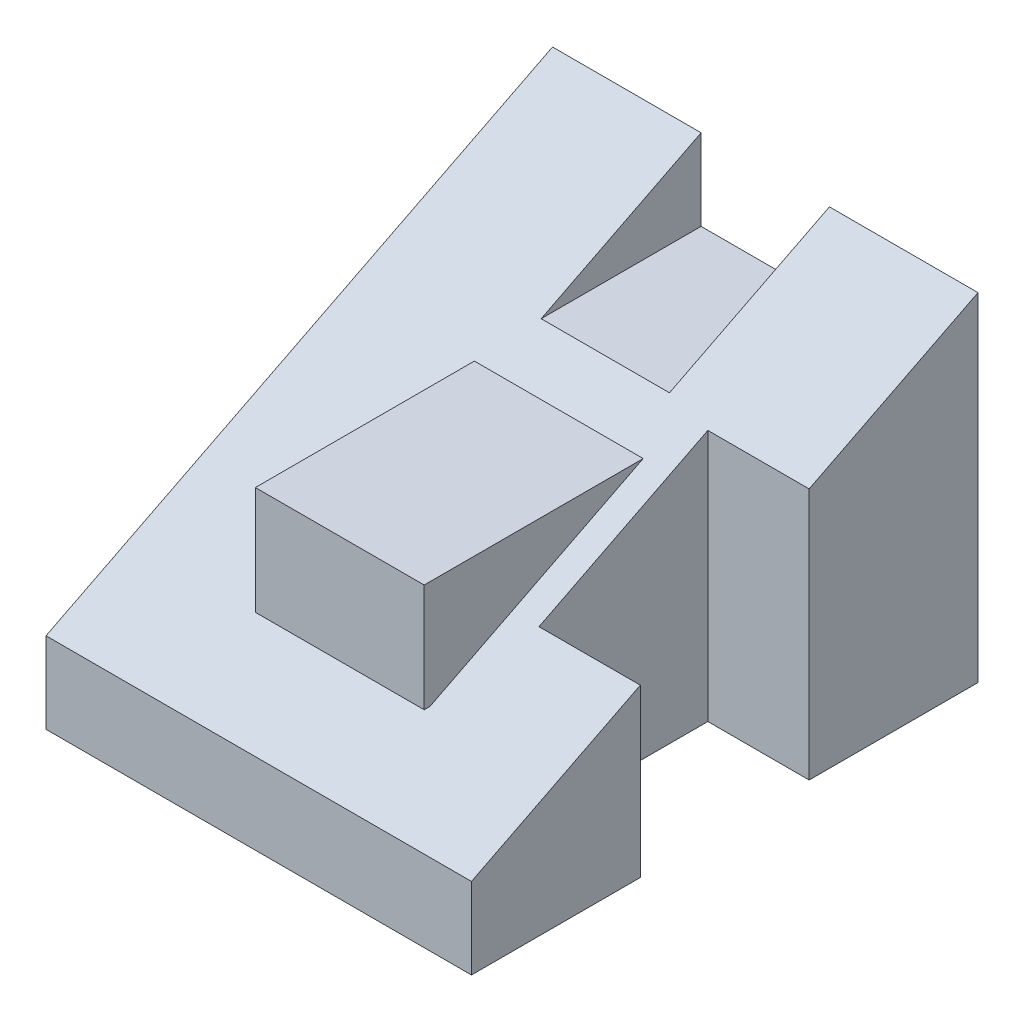
ISO-10303-21;
HEADER;
FILE_DESCRIPTION(('STEP AP214'),'2;1');
FILE_NAME('part.step','',(''),(''),'','','');
FILE_SCHEMA(('AUTOMOTIVE_DESIGN { 1 0 10303 214 1 1 1 1 }'));
ENDSEC;
DATA;
#1=APPLICATION_CONTEXT('core data for automotive mechanical design processes');
#2=APPLICATION_PROTOCOL_DEFINITION('international standard','automotive_design',2000,#1);
#3=PRODUCT_CONTEXT('',#1,'mechanical');
#4=PRODUCT('Part','Part','',(#3));
#5=PRODUCT_RELATED_PRODUCT_CATEGORY('part','',(#4));
#6=PRODUCT_DEFINITION_FORMATION('','',#4);
#7=PRODUCT_DEFINITION_CONTEXT('part definition',#1,'design');
#8=PRODUCT_DEFINITION('design','',#6,#7);
#9=PRODUCT_DEFINITION_SHAPE('','',#8);
#10=(LENGTH_UNIT() NAMED_UNIT(*) SI_UNIT(.MILLI.,.METRE.));
#11=(NAMED_UNIT(*) PLANE_ANGLE_UNIT() SI_UNIT($,.RADIAN.));
#12=(NAMED_UNIT(*) SI_UNIT($,.STERADIAN.) SOLID_ANGLE_UNIT());
#13=UNCERTAINTY_MEASURE_WITH_UNIT(LENGTH_MEASURE(1.E-05),#10,'distance_accuracy_value','');
#14=(GEOMETRIC_REPRESENTATION_CONTEXT(3) GLOBAL_UNCERTAINTY_ASSIGNED_CONTEXT((#13)) GLOBAL_UNIT_ASSIGNED_CONTEXT((#10,
#11,#12)) REPRESENTATION_CONTEXT('',''));
#15=CARTESIAN_POINT('',(0.,0.,0.));
#16=DIRECTION('',(0.,0.,1.));
#17=DIRECTION('',(1.,0.,0.));
#18=AXIS2_PLACEMENT_3D('',#15,#16,#17);
#19=CARTESIAN_POINT('',(-63.,50.,-75.));
#20=DIRECTION('',(0.,0.892035776030269,0.45196479318867));
#21=DIRECTION('',(0.,-0.45196479318867,0.892035776030269));
#22=AXIS2_PLACEMENT_3D('',#19,#20,#21);
#23=PLANE('',#22);
#24=DIRECTION('',(0.,0.45196479318867,-0.892035776030269));
#25=VECTOR('',#24,1.);
#26=CARTESIAN_POINT('',(-41.,17.310673362569,-10.4815921629651));
#27=LINE('',#26,#25);
#28=CARTESIAN_POINT('',(-41.,38.,-51.3157894736842));
#29=VERTEX_POINT('',#28);
#30=CARTESIAN_POINT('',(-41.,50.,-75.));
#31=VERTEX_POINT('',#30);
#32=EDGE_CURVE('E234',#29,#31,#27,.T.);
#33=ORIENTED_EDGE('',*,*,#32,.T.);
#34=DIRECTION('',(1.,0.,0.));
#35=VECTOR('',#34,1.);
#36=CARTESIAN_POINT('',(-63.,50.,-75.));
#37=LINE('',#36,#35);
#38=CARTESIAN_POINT('',(-63.,50.,-75.));
#39=VERTEX_POINT('',#38);
#40=EDGE_CURVE('E75',#39,#31,#37,.T.);
#41=ORIENTED_EDGE('',*,*,#40,.F.);
#42=DIRECTION('',(0.,-0.451964793188669,0.892035776030268));
#43=VECTOR('',#42,1.);
#44=CARTESIAN_POINT('',(-63.,50.,-75.));
#45=LINE('',#44,#43);
#46=CARTESIAN_POINT('',(-63.,12.,0.));
#47=VERTEX_POINT('',#46);
#48=EDGE_CURVE('E303',#39,#47,#45,.T.);
#49=ORIENTED_EDGE('',*,*,#48,.T.);
#50=DIRECTION('',(1.,0.,0.));
#51=VECTOR('',#50,1.);
#52=CARTESIAN_POINT('',(-63.,12.,0.));
#53=LINE('',#52,#51);
#54=CARTESIAN_POINT('',(0.,12.,0.));
#55=VERTEX_POINT('',#54);
#56=EDGE_CURVE('E12',#47,#55,#53,.T.);
#57=ORIENTED_EDGE('',*,*,#56,.T.);
#58=DIRECTION('',(0.,-0.451964793188669,0.892035776030268));
#59=VECTOR('',#58,1.);
#60=CARTESIAN_POINT('',(0.,50.,-75.));
#61=LINE('',#60,#59);
#62=CARTESIAN_POINT('',(0.,24.6666666666667,-25.));
#63=VERTEX_POINT('',#62);
#64=EDGE_CURVE('E319',#63,#55,#61,.T.);
#65=ORIENTED_EDGE('',*,*,#64,.F.);
#66=DIRECTION('',(1.,0.,0.));
#67=VECTOR('',#66,1.);
#68=CARTESIAN_POINT('',(-15.,24.6666666666667,-25.));
#69=LINE('',#68,#67);
#70=CARTESIAN_POINT('',(-15.,24.6666666666667,-25.));
#71=VERTEX_POINT('',#70);
#72=EDGE_CURVE('E271',#71,#63,#69,.T.);
#73=ORIENTED_EDGE('',*,*,#72,.F.);
#74=DIRECTION('',(0.,-0.451964793188669,0.892035776030268));
#75=VECTOR('',#74,1.);
#76=CARTESIAN_POINT('',(-15.,24.6666666666667,-25.));
#77=LINE('',#76,#75);
#78=CARTESIAN_POINT('',(-15.,37.3333333333333,-50.));
#79=VERTEX_POINT('',#78);
#80=EDGE_CURVE('E255',#79,#71,#77,.T.);
#81=ORIENTED_EDGE('',*,*,#80,.F.);
#82=DIRECTION('',(1.,0.,0.));
#83=VECTOR('',#82,1.);
#84=CARTESIAN_POINT('',(-15.,37.3333333333333,-50.));
#85=LINE('',#84,#83);
#86=CARTESIAN_POINT('',(0.,37.3333333333333,-50.));
#87=VERTEX_POINT('',#86);
#88=EDGE_CURVE('E276',#79,#87,#85,.T.);
#89=ORIENTED_EDGE('',*,*,#88,.T.);
#90=CARTESIAN_POINT('',(0.,50.,-75.));
#91=VERTEX_POINT('',#90);
#92=EDGE_CURVE('E295',#91,#87,#61,.T.);
#93=ORIENTED_EDGE('',*,*,#92,.F.);
#94=CARTESIAN_POINT('',(-22.,50.,-75.));
#95=VERTEX_POINT('',#94);
#96=EDGE_CURVE('E325',#95,#91,#37,.T.);
#97=ORIENTED_EDGE('',*,*,#96,.F.);
#98=DIRECTION('',(0.,-0.45196479318867,0.892035776030269));
#99=VECTOR('',#98,1.);
#100=CARTESIAN_POINT('',(-22.,19.7619394539539,-15.31961734333));
#101=LINE('',#100,#99);
#102=CARTESIAN_POINT('',(-22.,38.,-51.3157894736842));
#103=VERTEX_POINT('',#102);
#104=EDGE_CURVE('E91',#95,#103,#101,.T.);
#105=ORIENTED_EDGE('',*,*,#104,.T.);
#106=DIRECTION('',(-1.,0.,0.));
#107=VECTOR('',#106,1.);
#108=CARTESIAN_POINT('',(-22.,38.,-51.3157894736842));
#109=LINE('',#108,#107);
#110=EDGE_CURVE('E230',#103,#29,#109,.T.);
#111=ORIENTED_EDGE('',*,*,#110,.T.);
#112=EDGE_LOOP('',(#33,#41,#49,#57,#65,#73,#81,#89,#93,#97,#105,#111));
#113=FACE_BOUND('',#112,.T.);
#114=DIRECTION('',(-1.,0.,0.));
#115=VECTOR('',#114,1.);
#116=CARTESIAN_POINT('',(0.,34.5104040234503,-44.4284289936519));
#117=LINE('',#116,#115);
#118=CARTESIAN_POINT('',(-19.,34.5104040234503,-44.4284289936519));
#119=VERTEX_POINT('',#118);
#120=CARTESIAN_POINT('',(-44.,34.5104040234503,-44.4284289936519));
#121=VERTEX_POINT('',#120);
#122=EDGE_CURVE('E184',#119,#121,#117,.T.);
#123=ORIENTED_EDGE('',*,*,#122,.F.);
#124=DIRECTION('',(0.,0.45196479318867,-0.892035776030269));
#125=VECTOR('',#124,1.);
#126=CARTESIAN_POINT('',(-19.,39.7871976234262,-54.8431532041307));
#127=LINE('',#126,#125);
#128=CARTESIAN_POINT('',(-19.,18.5104040234503,-12.8494816252308));
#129=VERTEX_POINT('',#128);
#130=EDGE_CURVE('E181',#129,#119,#127,.T.);
#131=ORIENTED_EDGE('',*,*,#130,.F.);
#132=DIRECTION('',(-1.,0.,0.));
#133=VECTOR('',#132,1.);
#134=CARTESIAN_POINT('',(0.,18.5104040234503,-12.8494816252308));
#135=LINE('',#134,#133);
#136=CARTESIAN_POINT('',(-44.,18.5104040234503,-12.8494816252308));
#137=VERTEX_POINT('',#136);
#138=EDGE_CURVE('E216',#129,#137,#135,.T.);
#139=ORIENTED_EDGE('',*,*,#138,.T.);
#140=DIRECTION('',(0.,0.45196479318867,-0.892035776030269));
#141=VECTOR('',#140,1.);
#142=CARTESIAN_POINT('',(-44.,39.7871976234262,-54.8431532041307));
#143=LINE('',#142,#141);
#144=EDGE_CURVE('E220',#137,#121,#143,.T.);
#145=ORIENTED_EDGE('',*,*,#144,.T.);
#146=EDGE_LOOP('',(#123,#131,#139,#145));
#147=FACE_BOUND('',#146,.T.);
#148=ADVANCED_FACE('F65',(#113,#147),#23,.T.);
#149=CARTESIAN_POINT('',(0.,0.,0.));
#150=DIRECTION('',(1.,0.,0.));
#151=DIRECTION('',(0.,0.,-1.));
#152=AXIS2_PLACEMENT_3D('',#149,#150,#151);
#153=PLANE('',#152);
#154=DIRECTION('',(0.,1.,0.));
#155=VECTOR('',#154,1.);
#156=CARTESIAN_POINT('',(0.,37.3333333333333,-50.));
#157=LINE('',#156,#155);
#158=CARTESIAN_POINT('',(0.,0.,-50.));
#159=VERTEX_POINT('',#158);
#160=EDGE_CURVE('E260',#159,#87,#157,.T.);
#161=ORIENTED_EDGE('',*,*,#160,.F.);
#162=DIRECTION('',(0.,0.,-1.));
#163=VECTOR('',#162,1.);
#164=CARTESIAN_POINT('',(0.,0.,0.));
#165=LINE('',#164,#163);
#166=CARTESIAN_POINT('',(0.,0.,-75.));
#167=VERTEX_POINT('',#166);
#168=EDGE_CURVE('E310',#159,#167,#165,.T.);
#169=ORIENTED_EDGE('',*,*,#168,.T.);
#170=DIRECTION('',(0.,1.,0.));
#171=VECTOR('',#170,1.);
#172=CARTESIAN_POINT('',(0.,0.,-75.));
#173=LINE('',#172,#171);
#174=EDGE_CURVE('E315',#167,#91,#173,.T.);
#175=ORIENTED_EDGE('',*,*,#174,.T.);
#176=ORIENTED_EDGE('',*,*,#92,.T.);
#177=EDGE_LOOP('',(#161,#169,#175,#176));
#178=FACE_BOUND('',#177,.T.);
#179=ADVANCED_FACE('F361',(#178),#153,.T.);
#180=CARTESIAN_POINT('',(-63.,12.,0.));
#181=DIRECTION('',(0.,0.,1.));
#182=DIRECTION('',(1.,0.,0.));
#183=AXIS2_PLACEMENT_3D('',#180,#181,#182);
#184=PLANE('',#183);
#185=DIRECTION('',(0.,-1.,0.));
#186=VECTOR('',#185,1.);
#187=CARTESIAN_POINT('',(0.,12.,0.));
#188=LINE('',#187,#186);
#189=CARTESIAN_POINT('',(0.,0.,0.));
#190=VERTEX_POINT('',#189);
#191=EDGE_CURVE('E280',#55,#190,#188,.T.);
#192=ORIENTED_EDGE('',*,*,#191,.F.);
#193=ORIENTED_EDGE('',*,*,#56,.F.);
#194=DIRECTION('',(0.,-1.,0.));
#195=VECTOR('',#194,1.);
#196=CARTESIAN_POINT('',(-63.,12.,0.));
#197=LINE('',#196,#195);
#198=CARTESIAN_POINT('',(-63.,0.,0.));
#199=VERTEX_POINT('',#198);
#200=EDGE_CURVE('E290',#47,#199,#197,.T.);
#201=ORIENTED_EDGE('',*,*,#200,.T.);
#202=DIRECTION('',(1.,0.,0.));
#203=VECTOR('',#202,1.);
#204=CARTESIAN_POINT('',(-63.,0.,0.));
#205=LINE('',#204,#203);
#206=EDGE_CURVE('E69',#199,#190,#205,.T.);
#207=ORIENTED_EDGE('',*,*,#206,.T.);
#208=EDGE_LOOP('',(#192,#193,#201,#207));
#209=FACE_BOUND('',#208,.T.);
#210=ADVANCED_FACE('F67',(#209),#184,.T.);
#211=CARTESIAN_POINT('',(-63.,0.,-75.));
#212=DIRECTION('',(0.,0.,-1.));
#213=DIRECTION('',(-1.,0.,0.));
#214=AXIS2_PLACEMENT_3D('',#211,#212,#213);
#215=PLANE('',#214);
#216=DIRECTION('',(0.,1.,0.));
#217=VECTOR('',#216,1.);
#218=CARTESIAN_POINT('',(-41.,38.,-75.));
#219=LINE('',#218,#217);
#220=CARTESIAN_POINT('',(-41.,38.,-75.));
#221=VERTEX_POINT('',#220);
#222=EDGE_CURVE('E245',#221,#31,#219,.T.);
#223=ORIENTED_EDGE('',*,*,#222,.F.);
#224=DIRECTION('',(-1.,0.,0.));
#225=VECTOR('',#224,1.);
#226=CARTESIAN_POINT('',(-22.,38.,-75.));
#227=LINE('',#226,#225);
#228=CARTESIAN_POINT('',(-22.,38.,-75.));
#229=VERTEX_POINT('',#228);
#230=EDGE_CURVE('E241',#229,#221,#227,.T.);
#231=ORIENTED_EDGE('',*,*,#230,.F.);
#232=DIRECTION('',(0.,-1.,0.));
#233=VECTOR('',#232,1.);
#234=CARTESIAN_POINT('',(-22.,50.,-75.));
#235=LINE('',#234,#233);
#236=EDGE_CURVE('E238',#95,#229,#235,.T.);
#237=ORIENTED_EDGE('',*,*,#236,.F.);
#238=ORIENTED_EDGE('',*,*,#96,.T.);
#239=ORIENTED_EDGE('',*,*,#174,.F.);
#240=DIRECTION('',(1.,0.,0.));
#241=VECTOR('',#240,1.);
#242=CARTESIAN_POINT('',(-63.,0.,-75.));
#243=LINE('',#242,#241);
#244=CARTESIAN_POINT('',(-63.,0.,-75.));
#245=VERTEX_POINT('',#244);
#246=EDGE_CURVE('E326',#245,#167,#243,.T.);
#247=ORIENTED_EDGE('',*,*,#246,.F.);
#248=DIRECTION('',(0.,1.,0.));
#249=VECTOR('',#248,1.);
#250=CARTESIAN_POINT('',(-63.,0.,-75.));
#251=LINE('',#250,#249);
#252=EDGE_CURVE('E299',#245,#39,#251,.T.);
#253=ORIENTED_EDGE('',*,*,#252,.T.);
#254=ORIENTED_EDGE('',*,*,#40,.T.);
#255=EDGE_LOOP('',(#223,#231,#237,#238,#239,#247,#253,#254));
#256=FACE_BOUND('',#255,.T.);
#257=ADVANCED_FACE('F356',(#256),#215,.T.);
#258=CARTESIAN_POINT('',(-63.,0.,0.));
#259=DIRECTION('',(0.,-1.,0.));
#260=DIRECTION('',(0.,0.,-1.));
#261=AXIS2_PLACEMENT_3D('',#258,#259,#260);
#262=PLANE('',#261);
#263=DIRECTION('',(1.,0.,0.));
#264=VECTOR('',#263,1.);
#265=CARTESIAN_POINT('',(-15.,0.,-50.));
#266=LINE('',#265,#264);
#267=CARTESIAN_POINT('',(-15.,0.,-50.));
#268=VERTEX_POINT('',#267);
#269=EDGE_CURVE('E281',#268,#159,#266,.T.);
#270=ORIENTED_EDGE('',*,*,#269,.F.);
#271=DIRECTION('',(0.,0.,-1.));
#272=VECTOR('',#271,1.);
#273=CARTESIAN_POINT('',(-15.,0.,-25.));
#274=LINE('',#273,#272);
#275=CARTESIAN_POINT('',(-15.,0.,-25.));
#276=VERTEX_POINT('',#275);
#277=EDGE_CURVE('E264',#276,#268,#274,.T.);
#278=ORIENTED_EDGE('',*,*,#277,.F.);
#279=DIRECTION('',(1.,0.,0.));
#280=VECTOR('',#279,1.);
#281=CARTESIAN_POINT('',(-15.,0.,-25.));
#282=LINE('',#281,#280);
#283=CARTESIAN_POINT('',(0.,0.,-25.));
#284=VERTEX_POINT('',#283);
#285=EDGE_CURVE('E284',#276,#284,#282,.T.);
#286=ORIENTED_EDGE('',*,*,#285,.T.);
#287=EDGE_CURVE('E311',#190,#284,#165,.T.);
#288=ORIENTED_EDGE('',*,*,#287,.F.);
#289=ORIENTED_EDGE('',*,*,#206,.F.);
#290=DIRECTION('',(0.,0.,-1.));
#291=VECTOR('',#290,1.);
#292=CARTESIAN_POINT('',(-63.,0.,0.));
#293=LINE('',#292,#291);
#294=EDGE_CURVE('E294',#199,#245,#293,.T.);
#295=ORIENTED_EDGE('',*,*,#294,.T.);
#296=ORIENTED_EDGE('',*,*,#246,.T.);
#297=ORIENTED_EDGE('',*,*,#168,.F.);
#298=EDGE_LOOP('',(#270,#278,#286,#288,#289,#295,#296,#297));
#299=FACE_BOUND('',#298,.T.);
#300=ADVANCED_FACE('F340',(#299),#262,.T.);
#301=CARTESIAN_POINT('',(-63.,0.,0.));
#302=DIRECTION('',(1.,0.,0.));
#303=DIRECTION('',(0.,0.,-1.));
#304=AXIS2_PLACEMENT_3D('',#301,#302,#303);
#305=PLANE('',#304);
#306=ORIENTED_EDGE('',*,*,#200,.F.);
#307=ORIENTED_EDGE('',*,*,#48,.F.);
#308=ORIENTED_EDGE('',*,*,#252,.F.);
#309=ORIENTED_EDGE('',*,*,#294,.F.);
#310=EDGE_LOOP('',(#306,#307,#308,#309));
#311=FACE_BOUND('',#310,.T.);
#312=ADVANCED_FACE('F352',(#311),#305,.F.);
#313=DIRECTION('',(0.,-1.,0.));
#314=VECTOR('',#313,1.);
#315=CARTESIAN_POINT('',(0.,24.6666666666667,-25.));
#316=LINE('',#315,#314);
#317=EDGE_CURVE('E252',#63,#284,#316,.T.);
#318=ORIENTED_EDGE('',*,*,#317,.F.);
#319=ORIENTED_EDGE('',*,*,#64,.T.);
#320=ORIENTED_EDGE('',*,*,#191,.T.);
#321=ORIENTED_EDGE('',*,*,#287,.T.);
#322=EDGE_LOOP('',(#318,#319,#320,#321));
#323=FACE_BOUND('',#322,.T.);
#324=ADVANCED_FACE('F344',(#323),#153,.T.);
#325=CARTESIAN_POINT('',(-15.,37.3333333333333,-50.));
#326=DIRECTION('',(0.,0.,-1.));
#327=DIRECTION('',(0.,1.,0.));
#328=AXIS2_PLACEMENT_3D('',#325,#326,#327);
#329=PLANE('',#328);
#330=ORIENTED_EDGE('',*,*,#160,.T.);
#331=ORIENTED_EDGE('',*,*,#88,.F.);
#332=DIRECTION('',(0.,1.,0.));
#333=VECTOR('',#332,1.);
#334=CARTESIAN_POINT('',(-15.,37.3333333333333,-50.));
#335=LINE('',#334,#333);
#336=EDGE_CURVE('E267',#268,#79,#335,.T.);
#337=ORIENTED_EDGE('',*,*,#336,.F.);
#338=ORIENTED_EDGE('',*,*,#269,.T.);
#339=EDGE_LOOP('',(#330,#331,#337,#338));
#340=FACE_BOUND('',#339,.T.);
#341=ADVANCED_FACE('F365',(#340),#329,.F.);
#342=CARTESIAN_POINT('',(-15.,24.6666666666667,-25.));
#343=DIRECTION('',(0.,0.,1.));
#344=DIRECTION('',(0.,-1.,0.));
#345=AXIS2_PLACEMENT_3D('',#342,#343,#344);
#346=PLANE('',#345);
#347=ORIENTED_EDGE('',*,*,#317,.T.);
#348=ORIENTED_EDGE('',*,*,#285,.F.);
#349=DIRECTION('',(0.,-1.,0.));
#350=VECTOR('',#349,1.);
#351=CARTESIAN_POINT('',(-15.,24.6666666666667,-25.));
#352=LINE('',#351,#350);
#353=EDGE_CURVE('E259',#71,#276,#352,.T.);
#354=ORIENTED_EDGE('',*,*,#353,.F.);
#355=ORIENTED_EDGE('',*,*,#72,.T.);
#356=EDGE_LOOP('',(#347,#348,#354,#355));
#357=FACE_BOUND('',#356,.T.);
#358=ADVANCED_FACE('F370',(#357),#346,.F.);
#359=CARTESIAN_POINT('',(-15.,0.,0.));
#360=DIRECTION('',(-1.,0.,0.));
#361=DIRECTION('',(0.,0.,1.));
#362=AXIS2_PLACEMENT_3D('',#359,#360,#361);
#363=PLANE('',#362);
#364=ORIENTED_EDGE('',*,*,#80,.T.);
#365=ORIENTED_EDGE('',*,*,#353,.T.);
#366=ORIENTED_EDGE('',*,*,#277,.T.);
#367=ORIENTED_EDGE('',*,*,#336,.T.);
#368=EDGE_LOOP('',(#364,#365,#366,#367));
#369=FACE_BOUND('',#368,.T.);
#370=ADVANCED_FACE('F367',(#369),#363,.F.);
#371=CARTESIAN_POINT('',(-41.,38.,0.001000000000001));
#372=DIRECTION('',(-1.,0.,0.));
#373=DIRECTION('',(0.,0.,1.));
#374=AXIS2_PLACEMENT_3D('',#371,#372,#373);
#375=PLANE('',#374);
#376=DIRECTION('',(0.,0.,-1.));
#377=VECTOR('',#376,1.);
#378=CARTESIAN_POINT('',(-41.,38.,0.001000000000001));
#379=LINE('',#378,#377);
#380=EDGE_CURVE('E249',#29,#221,#379,.T.);
#381=ORIENTED_EDGE('',*,*,#380,.T.);
#382=ORIENTED_EDGE('',*,*,#222,.T.);
#383=ORIENTED_EDGE('',*,*,#32,.F.);
#384=EDGE_LOOP('',(#381,#382,#383));
#385=FACE_BOUND('',#384,.T.);
#386=ADVANCED_FACE('F377',(#385),#375,.F.);
#387=CARTESIAN_POINT('',(-22.,38.,0.001000000000001));
#388=DIRECTION('',(0.,-1.,0.));
#389=DIRECTION('',(0.,0.,-1.));
#390=AXIS2_PLACEMENT_3D('',#387,#388,#389);
#391=PLANE('',#390);
#392=DIRECTION('',(0.,0.,-1.));
#393=VECTOR('',#392,1.);
#394=CARTESIAN_POINT('',(-22.,38.,0.001000000000001));
#395=LINE('',#394,#393);
#396=EDGE_CURVE('E248',#103,#229,#395,.T.);
#397=ORIENTED_EDGE('',*,*,#396,.T.);
#398=ORIENTED_EDGE('',*,*,#230,.T.);
#399=ORIENTED_EDGE('',*,*,#380,.F.);
#400=ORIENTED_EDGE('',*,*,#110,.F.);
#401=EDGE_LOOP('',(#397,#398,#399,#400));
#402=FACE_BOUND('',#401,.T.);
#403=ADVANCED_FACE('F431',(#402),#391,.F.);
#404=CARTESIAN_POINT('',(-22.,50.,0.001000000000001));
#405=DIRECTION('',(1.,0.,0.));
#406=DIRECTION('',(0.,0.,-1.));
#407=AXIS2_PLACEMENT_3D('',#404,#405,#406);
#408=PLANE('',#407);
#409=ORIENTED_EDGE('',*,*,#236,.T.);
#410=ORIENTED_EDGE('',*,*,#396,.F.);
#411=ORIENTED_EDGE('',*,*,#104,.F.);
#412=EDGE_LOOP('',(#409,#410,#411));
#413=FACE_BOUND('',#412,.T.);
#414=ADVANCED_FACE('F441',(#413),#408,.F.);
#415=CARTESIAN_POINT('',(-19.,0.,-75.002));
#416=DIRECTION('',(-1.,0.,0.));
#417=DIRECTION('',(0.,-1.,0.));
#418=AXIS2_PLACEMENT_3D('',#415,#416,#417);
#419=PLANE('',#418);
#420=DIRECTION('',(0.,0.,1.));
#421=VECTOR('',#420,1.);
#422=CARTESIAN_POINT('',(-19.,18.5104040234503,-75.002));
#423=LINE('',#422,#421);
#424=CARTESIAN_POINT('',(-19.,18.5104040234503,-12.));
#425=VERTEX_POINT('',#424);
#426=EDGE_CURVE('E208',#129,#425,#423,.T.);
#427=ORIENTED_EDGE('',*,*,#426,.F.);
#428=ORIENTED_EDGE('',*,*,#130,.T.);
#429=DIRECTION('',(0.,0.,1.));
#430=VECTOR('',#429,1.);
#431=CARTESIAN_POINT('',(-19.,34.5104040234503,-75.002));
#432=LINE('',#431,#430);
#433=CARTESIAN_POINT('',(-19.,34.5104040234503,-12.));
#434=VERTEX_POINT('',#433);
#435=EDGE_CURVE('E83',#119,#434,#432,.T.);
#436=ORIENTED_EDGE('',*,*,#435,.T.);
#437=DIRECTION('',(0.,-1.,0.));
#438=VECTOR('',#437,1.);
#439=CARTESIAN_POINT('',(-19.,0.,-12.));
#440=LINE('',#439,#438);
#441=EDGE_CURVE('E179',#434,#425,#440,.T.);
#442=ORIENTED_EDGE('',*,*,#441,.T.);
#443=EDGE_LOOP('',(#427,#428,#436,#442));
#444=FACE_BOUND('',#443,.T.);
#445=ADVANCED_FACE('F177',(#444),#419,.F.);
#446=CARTESIAN_POINT('',(0.,18.5104040234503,-75.002));
#447=DIRECTION('',(0.,-1.,0.));
#448=DIRECTION('',(0.,0.,-1.));
#449=AXIS2_PLACEMENT_3D('',#446,#447,#448);
#450=PLANE('',#449);
#451=ORIENTED_EDGE('',*,*,#138,.F.);
#452=ORIENTED_EDGE('',*,*,#426,.T.);
#453=DIRECTION('',(1.,0.,0.));
#454=VECTOR('',#453,1.);
#455=CARTESIAN_POINT('',(0.,18.5104040234503,-12.));
#456=LINE('',#455,#454);
#457=CARTESIAN_POINT('',(-44.,18.5104040234503,-12.));
#458=VERTEX_POINT('',#457);
#459=EDGE_CURVE('E200',#458,#425,#456,.T.);
#460=ORIENTED_EDGE('',*,*,#459,.F.);
#461=DIRECTION('',(0.,0.,1.));
#462=VECTOR('',#461,1.);
#463=CARTESIAN_POINT('',(-44.,18.5104040234503,-75.002));
#464=LINE('',#463,#462);
#465=EDGE_CURVE('E211',#137,#458,#464,.T.);
#466=ORIENTED_EDGE('',*,*,#465,.F.);
#467=EDGE_LOOP('',(#451,#452,#460,#466));
#468=FACE_BOUND('',#467,.T.);
#469=ADVANCED_FACE('F451',(#468),#450,.T.);
#470=CARTESIAN_POINT('',(-44.,0.,-75.002));
#471=DIRECTION('',(-1.,0.,0.));
#472=DIRECTION('',(0.,-1.,0.));
#473=AXIS2_PLACEMENT_3D('',#470,#471,#472);
#474=PLANE('',#473);
#475=ORIENTED_EDGE('',*,*,#144,.F.);
#476=ORIENTED_EDGE('',*,*,#465,.T.);
#477=DIRECTION('',(0.,-1.,0.));
#478=VECTOR('',#477,1.);
#479=CARTESIAN_POINT('',(-44.,0.,-12.));
#480=LINE('',#479,#478);
#481=CARTESIAN_POINT('',(-44.,34.5104040234503,-12.));
#482=VERTEX_POINT('',#481);
#483=EDGE_CURVE('E195',#482,#458,#480,.T.);
#484=ORIENTED_EDGE('',*,*,#483,.F.);
#485=DIRECTION('',(0.,0.,1.));
#486=VECTOR('',#485,1.);
#487=CARTESIAN_POINT('',(-44.,34.5104040234503,-75.002));
#488=LINE('',#487,#486);
#489=EDGE_CURVE('E185',#121,#482,#488,.T.);
#490=ORIENTED_EDGE('',*,*,#489,.F.);
#491=EDGE_LOOP('',(#475,#476,#484,#490));
#492=FACE_BOUND('',#491,.T.);
#493=ADVANCED_FACE('F466',(#492),#474,.T.);
#494=CARTESIAN_POINT('',(0.,0.,-12.));
#495=DIRECTION('',(0.,0.,1.));
#496=DIRECTION('',(1.,0.,0.));
#497=AXIS2_PLACEMENT_3D('',#494,#495,#496);
#498=PLANE('',#497);
#499=ORIENTED_EDGE('',*,*,#441,.F.);
#500=DIRECTION('',(1.,0.,0.));
#501=VECTOR('',#500,1.);
#502=CARTESIAN_POINT('',(0.,34.5104040234503,-12.));
#503=LINE('',#502,#501);
#504=EDGE_CURVE('E188',#482,#434,#503,.T.);
#505=ORIENTED_EDGE('',*,*,#504,.F.);
#506=ORIENTED_EDGE('',*,*,#483,.T.);
#507=ORIENTED_EDGE('',*,*,#459,.T.);
#508=EDGE_LOOP('',(#499,#505,#506,#507));
#509=FACE_BOUND('',#508,.T.);
#510=ADVANCED_FACE('F198',(#509),#498,.T.);
#511=CARTESIAN_POINT('',(0.,34.5104040234503,-75.002));
#512=DIRECTION('',(0.,-1.,0.));
#513=DIRECTION('',(0.,0.,-1.));
#514=AXIS2_PLACEMENT_3D('',#511,#512,#513);
#515=PLANE('',#514);
#516=ORIENTED_EDGE('',*,*,#435,.F.);
#517=ORIENTED_EDGE('',*,*,#122,.T.);
#518=ORIENTED_EDGE('',*,*,#489,.T.);
#519=ORIENTED_EDGE('',*,*,#504,.T.);
#520=EDGE_LOOP('',(#516,#517,#518,#519));
#521=FACE_BOUND('',#520,.T.);
#522=ADVANCED_FACE('F189',(#521),#515,.F.);
#523=CLOSED_SHELL('',(#148,#179,#210,#257,#300,#312,#324,#341,#358,#370,#386,#403,#414,#445,
#469,#493,#510,#522));
#524=MANIFOLD_SOLID_BREP('B2',#523);
#525=ADVANCED_BREP_SHAPE_REPRESENTATION('',(#18,#524),#14);
#526=SHAPE_DEFINITION_REPRESENTATION(#9,#525);
ENDSEC;
END-ISO-10303-21;
